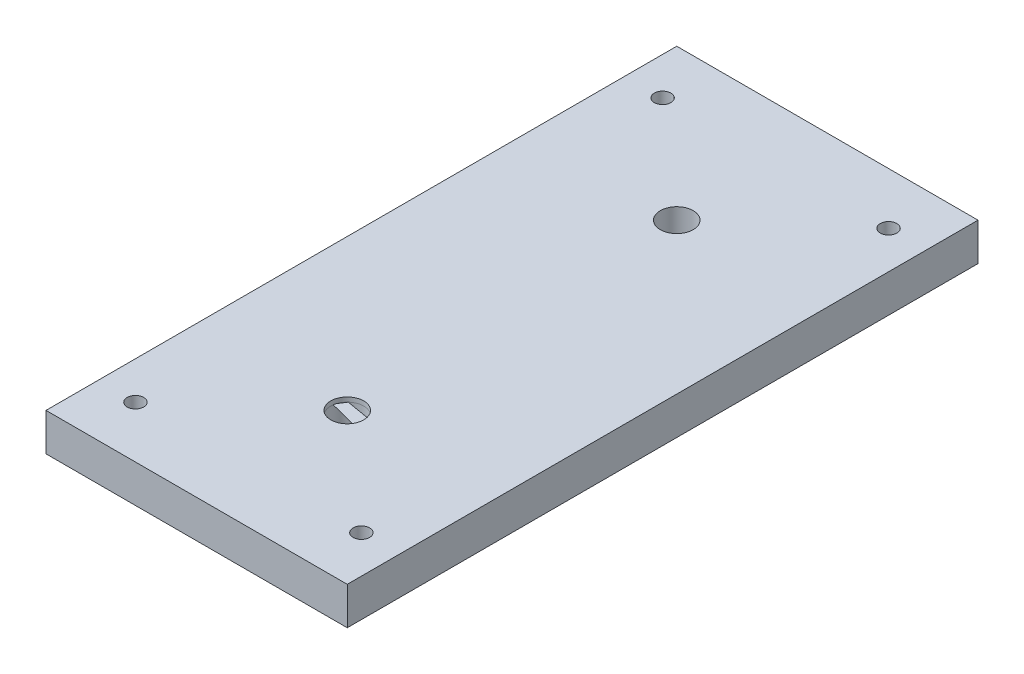
ISO-10303-21;
HEADER;
FILE_DESCRIPTION(('STEP AP214'),'2;1');
FILE_NAME('part.step','',(''),(''),'','','');
FILE_SCHEMA(('AUTOMOTIVE_DESIGN { 1 0 10303 214 1 1 1 1 }'));
ENDSEC;
DATA;
#1=APPLICATION_CONTEXT('core data for automotive mechanical design processes');
#2=APPLICATION_PROTOCOL_DEFINITION('international standard','automotive_design',2000,#1);
#3=PRODUCT_CONTEXT('',#1,'mechanical');
#4=PRODUCT('Part','Part','',(#3));
#5=PRODUCT_RELATED_PRODUCT_CATEGORY('part','',(#4));
#6=PRODUCT_DEFINITION_FORMATION('','',#4);
#7=PRODUCT_DEFINITION_CONTEXT('part definition',#1,'design');
#8=PRODUCT_DEFINITION('design','',#6,#7);
#9=PRODUCT_DEFINITION_SHAPE('','',#8);
#10=(LENGTH_UNIT() NAMED_UNIT(*) SI_UNIT(.MILLI.,.METRE.));
#11=(NAMED_UNIT(*) PLANE_ANGLE_UNIT() SI_UNIT($,.RADIAN.));
#12=(NAMED_UNIT(*) SI_UNIT($,.STERADIAN.) SOLID_ANGLE_UNIT());
#13=UNCERTAINTY_MEASURE_WITH_UNIT(LENGTH_MEASURE(1.E-05),#10,'distance_accuracy_value','');
#14=(GEOMETRIC_REPRESENTATION_CONTEXT(3) GLOBAL_UNCERTAINTY_ASSIGNED_CONTEXT((#13)) GLOBAL_UNIT_ASSIGNED_CONTEXT((#10,
#11,#12)) REPRESENTATION_CONTEXT('',''));
#15=CARTESIAN_POINT('',(0.,0.,0.));
#16=DIRECTION('',(0.,0.,1.));
#17=DIRECTION('',(1.,0.,0.));
#18=AXIS2_PLACEMENT_3D('',#15,#16,#17);
#19=CARTESIAN_POINT('',(-3.1511529728443,-11.365306556526,-3.57587472478323));
#20=DIRECTION('',(0.,-1.,0.));
#21=DIRECTION('',(0.,0.,1.));
#22=AXIS2_PLACEMENT_3D('',#19,#20,#21);
#23=SPHERICAL_SURFACE('',#22,12.7);
#24=CARTESIAN_POINT('',(-3.1511529728443,-0.252806556526004,-3.57587472478323));
#25=DIRECTION('',(0.,-1.,0.));
#26=DIRECTION('',(0.,0.,-1.));
#27=AXIS2_PLACEMENT_3D('',#24,#25,#26);
#28=CIRCLE('',#27,6.14836106210427);
#29=CARTESIAN_POINT('',(-3.1511529728443,-0.252806556526004,-9.7242357868875));
#30=VERTEX_POINT('',#29);
#31=EDGE_CURVE('E11',#30,#30,#28,.T.);
#32=ORIENTED_EDGE('',*,*,#31,.F.);
#33=EDGE_LOOP('',(#32));
#34=FACE_BOUND('',#33,.T.);
#35=ADVANCED_FACE('F43',(#34),#23,.T.);
#36=CARTESIAN_POINT('',(-12.2889229741077,-0.252806556526004,-28.2015692205846));
#37=DIRECTION('',(0.,-1.,0.));
#38=DIRECTION('',(0.,0.,-1.));
#39=AXIS2_PLACEMENT_3D('',#36,#37,#38);
#40=PLANE('',#39);
#41=ORIENTED_EDGE('',*,*,#31,.T.);
#42=EDGE_LOOP('',(#41));
#43=FACE_BOUND('',#42,.T.);
#44=ADVANCED_FACE('F50',(#43),#40,.T.);
#45=CLOSED_SHELL('',(#35,#44));
#46=MANIFOLD_SOLID_BREP('B2',#45);
#47=CARTESIAN_POINT('',(0.,-0.252806556526004,0.));
#48=DIRECTION('',(0.,1.,0.));
#49=DIRECTION('',(0.,0.,1.));
#50=AXIS2_PLACEMENT_3D('',#47,#48,#49);
#51=PLANE('',#50);
#52=CARTESIAN_POINT('',(15.8988470271548,-0.252806556526004,40.8741252752168));
#53=DIRECTION('',(0.,-1.,0.));
#54=DIRECTION('',(0.,0.,-1.));
#55=AXIS2_PLACEMENT_3D('',#52,#53,#54);
#56=CIRCLE('',#55,1.397);
#57=CARTESIAN_POINT('',(15.8988470271548,-0.252806556526004,39.4771252752168));
#58=VERTEX_POINT('',#57);
#59=EDGE_CURVE('E241',#58,#58,#56,.T.);
#60=ORIENTED_EDGE('',*,*,#59,.F.);
#61=EDGE_LOOP('',(#60));
#62=FACE_BOUND('',#61,.T.);
#63=CARTESIAN_POINT('',(-22.2011529728452,-0.252806556526004,40.8741252752165));
#64=DIRECTION('',(0.,-1.,0.));
#65=DIRECTION('',(0.,0.,-1.));
#66=AXIS2_PLACEMENT_3D('',#63,#64,#65);
#67=CIRCLE('',#66,1.397);
#68=CARTESIAN_POINT('',(-22.2011529728452,-0.252806556526004,39.4771252752165));
#69=VERTEX_POINT('',#68);
#70=EDGE_CURVE('E237',#69,#69,#67,.T.);
#71=ORIENTED_EDGE('',*,*,#70,.F.);
#72=EDGE_LOOP('',(#71));
#73=FACE_BOUND('',#72,.T.);
#74=CARTESIAN_POINT('',(15.8988470271557,-0.252806556526004,-48.0258747247832));
#75=DIRECTION('',(0.,-1.,0.));
#76=DIRECTION('',(0.,0.,-1.));
#77=AXIS2_PLACEMENT_3D('',#74,#75,#76);
#78=CIRCLE('',#77,1.397);
#79=CARTESIAN_POINT('',(15.8988470271557,-0.252806556526004,-49.4228747247832));
#80=VERTEX_POINT('',#79);
#81=EDGE_CURVE('E233',#80,#80,#78,.T.);
#82=ORIENTED_EDGE('',*,*,#81,.F.);
#83=EDGE_LOOP('',(#82));
#84=FACE_BOUND('',#83,.T.);
#85=CARTESIAN_POINT('',(-22.2011529728443,-0.252806556526004,-48.0258747247835));
#86=DIRECTION('',(0.,-1.,0.));
#87=DIRECTION('',(0.,0.,-1.));
#88=AXIS2_PLACEMENT_3D('',#85,#86,#87);
#89=CIRCLE('',#88,1.397);
#90=CARTESIAN_POINT('',(-22.2011529728443,-0.252806556526004,-49.4228747247835));
#91=VERTEX_POINT('',#90);
#92=EDGE_CURVE('E228',#91,#91,#89,.T.);
#93=ORIENTED_EDGE('',*,*,#92,.F.);
#94=EDGE_LOOP('',(#93));
#95=FACE_BOUND('',#94,.T.);
#96=DIRECTION('',(1.,0.,0.));
#97=VECTOR('',#96,1.);
#98=CARTESIAN_POINT('',(-28.5511529728443,-0.252806556526004,49.6053752752168));
#99=LINE('',#98,#97);
#100=CARTESIAN_POINT('',(-28.5511529728443,-0.252806556526004,49.6053752752168));
#101=VERTEX_POINT('',#100);
#102=CARTESIAN_POINT('',(22.2488470271557,-0.252806556526004,49.6053752752168));
#103=VERTEX_POINT('',#102);
#104=EDGE_CURVE('E124',#101,#103,#99,.T.);
#105=ORIENTED_EDGE('',*,*,#104,.F.);
#106=DIRECTION('',(0.,0.,1.));
#107=VECTOR('',#106,1.);
#108=CARTESIAN_POINT('',(-28.5511529728443,-0.252806556526004,-56.7571247247832));
#109=LINE('',#108,#107);
#110=CARTESIAN_POINT('',(-28.5511529728443,-0.252806556526004,-56.7571247247832));
#111=VERTEX_POINT('',#110);
#112=EDGE_CURVE('E113',#111,#101,#109,.T.);
#113=ORIENTED_EDGE('',*,*,#112,.F.);
#114=DIRECTION('',(-1.,0.,0.));
#115=VECTOR('',#114,1.);
#116=CARTESIAN_POINT('',(-28.5511529728443,-0.252806556526004,-56.7571247247832));
#117=LINE('',#116,#115);
#118=CARTESIAN_POINT('',(22.2488470271557,-0.252806556526004,-56.7571247247832));
#119=VERTEX_POINT('',#118);
#120=EDGE_CURVE('E133',#119,#111,#117,.T.);
#121=ORIENTED_EDGE('',*,*,#120,.F.);
#122=DIRECTION('',(0.,0.,-1.));
#123=VECTOR('',#122,1.);
#124=CARTESIAN_POINT('',(22.2488470271557,-0.252806556526004,-56.7571247247832));
#125=LINE('',#124,#123);
#126=EDGE_CURVE('E137',#103,#119,#125,.T.);
#127=ORIENTED_EDGE('',*,*,#126,.F.);
#128=EDGE_LOOP('',(#105,#113,#121,#127));
#129=FACE_BOUND('',#128,.T.);
#130=CARTESIAN_POINT('',(-3.15115297284421,-0.252806556526004,-31.3571247247832));
#131=DIRECTION('',(0.,1.,0.));
#132=DIRECTION('',(0.,0.,1.));
#133=AXIS2_PLACEMENT_3D('',#130,#131,#132);
#134=CIRCLE('',#133,2.7781250000001);
#135=CARTESIAN_POINT('',(-3.15115297284431,-0.252806556526005,-34.1352497247832));
#136=VERTEX_POINT('',#135);
#137=EDGE_CURVE('E225',#136,#136,#134,.T.);
#138=ORIENTED_EDGE('',*,*,#137,.T.);
#139=EDGE_LOOP('',(#138));
#140=FACE_BOUND('',#139,.T.);
#141=CARTESIAN_POINT('',(-3.17534581292681,-0.252806556526004,24.2114587291356));
#142=DIRECTION('',(0.,1.,0.));
#143=DIRECTION('',(0.,0.,1.));
#144=AXIS2_PLACEMENT_3D('',#141,#142,#143);
#145=CIRCLE('',#144,2.80307098009381);
#146=CARTESIAN_POINT('',(-3.17534581292681,-0.252806556526004,27.0145297092294));
#147=VERTEX_POINT('',#146);
#148=EDGE_CURVE('E145',#147,#147,#145,.T.);
#149=ORIENTED_EDGE('',*,*,#148,.T.);
#150=EDGE_LOOP('',(#149));
#151=FACE_BOUND('',#150,.T.);
#152=ADVANCED_FACE('F70',(#62,#73,#84,#95,#129,#140,#151),#51,.F.);
#153=CARTESIAN_POINT('',(-3.17534581292681,-0.252806556526004,24.2114587291356));
#154=DIRECTION('',(0.,1.,0.));
#155=DIRECTION('',(0.,0.,1.));
#156=AXIS2_PLACEMENT_3D('',#153,#154,#155);
#157=CYLINDRICAL_SURFACE('',#156,2.80307098009381);
#158=ORIENTED_EDGE('',*,*,#148,.F.);
#159=EDGE_LOOP('',(#158));
#160=FACE_BOUND('',#159,.T.);
#161=CARTESIAN_POINT('',(-3.17534581292681,5.335193443474,24.2114587291356));
#162=DIRECTION('',(0.,1.,0.));
#163=DIRECTION('',(0.,0.,1.));
#164=AXIS2_PLACEMENT_3D('',#161,#162,#163);
#165=CIRCLE('',#164,2.80307098009381);
#166=CARTESIAN_POINT('',(-0.456901891047282,5.335193443474,23.5278875455415));
#167=VERTEX_POINT('',#166);
#168=EDGE_CURVE('E152',#167,#167,#165,.T.);
#169=ORIENTED_EDGE('',*,*,#168,.T.);
#170=EDGE_LOOP('',(#169));
#171=FACE_BOUND('',#170,.T.);
#172=ADVANCED_FACE('F163',(#160,#171),#157,.F.);
#173=CARTESIAN_POINT('',(-28.5511529728443,-0.252806556526004,-56.7571247247832));
#174=DIRECTION('',(-1.,0.,0.));
#175=DIRECTION('',(0.,0.,1.));
#176=AXIS2_PLACEMENT_3D('',#173,#174,#175);
#177=PLANE('',#176);
#178=DIRECTION('',(0.,0.,1.));
#179=VECTOR('',#178,1.);
#180=CARTESIAN_POINT('',(-28.5511529728443,6.097193443474,-56.7571247247832));
#181=LINE('',#180,#179);
#182=CARTESIAN_POINT('',(-28.5511529728443,6.097193443474,-56.7571247247832));
#183=VERTEX_POINT('',#182);
#184=CARTESIAN_POINT('',(-28.5511529728443,6.097193443474,49.6053752752168));
#185=VERTEX_POINT('',#184);
#186=EDGE_CURVE('E143',#183,#185,#181,.T.);
#187=ORIENTED_EDGE('',*,*,#186,.F.);
#188=DIRECTION('',(0.,1.,0.));
#189=VECTOR('',#188,1.);
#190=CARTESIAN_POINT('',(-28.5511529728443,-0.252806556526004,-56.7571247247832));
#191=LINE('',#190,#189);
#192=EDGE_CURVE('E119',#111,#183,#191,.T.);
#193=ORIENTED_EDGE('',*,*,#192,.F.);
#194=ORIENTED_EDGE('',*,*,#112,.T.);
#195=DIRECTION('',(0.,1.,0.));
#196=VECTOR('',#195,1.);
#197=CARTESIAN_POINT('',(-28.5511529728443,-0.252806556526004,49.6053752752168));
#198=LINE('',#197,#196);
#199=EDGE_CURVE('E116',#101,#185,#198,.T.);
#200=ORIENTED_EDGE('',*,*,#199,.T.);
#201=EDGE_LOOP('',(#187,#193,#194,#200));
#202=FACE_BOUND('',#201,.T.);
#203=ADVANCED_FACE('F115',(#202),#177,.T.);
#204=CARTESIAN_POINT('',(-28.5511529728443,-0.252806556526004,-56.7571247247832));
#205=DIRECTION('',(0.,0.,-1.));
#206=DIRECTION('',(-1.,0.,0.));
#207=AXIS2_PLACEMENT_3D('',#204,#205,#206);
#208=PLANE('',#207);
#209=DIRECTION('',(-1.,0.,0.));
#210=VECTOR('',#209,1.);
#211=CARTESIAN_POINT('',(-28.5511529728443,6.097193443474,-56.7571247247832));
#212=LINE('',#211,#210);
#213=CARTESIAN_POINT('',(22.2488470271557,6.097193443474,-56.7571247247832));
#214=VERTEX_POINT('',#213);
#215=EDGE_CURVE('E125',#214,#183,#212,.T.);
#216=ORIENTED_EDGE('',*,*,#215,.F.);
#217=DIRECTION('',(0.,1.,0.));
#218=VECTOR('',#217,1.);
#219=CARTESIAN_POINT('',(22.2488470271557,-0.252806556526004,-56.7571247247832));
#220=LINE('',#219,#218);
#221=EDGE_CURVE('E153',#119,#214,#220,.T.);
#222=ORIENTED_EDGE('',*,*,#221,.F.);
#223=ORIENTED_EDGE('',*,*,#120,.T.);
#224=ORIENTED_EDGE('',*,*,#192,.T.);
#225=EDGE_LOOP('',(#216,#222,#223,#224));
#226=FACE_BOUND('',#225,.T.);
#227=ADVANCED_FACE('F171',(#226),#208,.T.);
#228=CARTESIAN_POINT('',(22.2488470271557,-0.252806556526004,-56.7571247247832));
#229=DIRECTION('',(1.,0.,0.));
#230=DIRECTION('',(0.,0.,-1.));
#231=AXIS2_PLACEMENT_3D('',#228,#229,#230);
#232=PLANE('',#231);
#233=DIRECTION('',(0.,0.,-1.));
#234=VECTOR('',#233,1.);
#235=CARTESIAN_POINT('',(22.2488470271557,6.097193443474,-56.7571247247832));
#236=LINE('',#235,#234);
#237=CARTESIAN_POINT('',(22.2488470271557,6.097193443474,49.6053752752168));
#238=VERTEX_POINT('',#237);
#239=EDGE_CURVE('E147',#238,#214,#236,.T.);
#240=ORIENTED_EDGE('',*,*,#239,.F.);
#241=DIRECTION('',(0.,1.,0.));
#242=VECTOR('',#241,1.);
#243=CARTESIAN_POINT('',(22.2488470271557,-0.252806556526004,49.6053752752168));
#244=LINE('',#243,#242);
#245=EDGE_CURVE('E132',#103,#238,#244,.T.);
#246=ORIENTED_EDGE('',*,*,#245,.F.);
#247=ORIENTED_EDGE('',*,*,#126,.T.);
#248=ORIENTED_EDGE('',*,*,#221,.T.);
#249=EDGE_LOOP('',(#240,#246,#247,#248));
#250=FACE_BOUND('',#249,.T.);
#251=ADVANCED_FACE('F182',(#250),#232,.T.);
#252=CARTESIAN_POINT('',(-28.5511529728443,-0.252806556526004,49.6053752752168));
#253=DIRECTION('',(0.,0.,1.));
#254=DIRECTION('',(1.,0.,0.));
#255=AXIS2_PLACEMENT_3D('',#252,#253,#254);
#256=PLANE('',#255);
#257=DIRECTION('',(1.,0.,0.));
#258=VECTOR('',#257,1.);
#259=CARTESIAN_POINT('',(-28.5511529728443,6.097193443474,49.6053752752168));
#260=LINE('',#259,#258);
#261=EDGE_CURVE('E131',#185,#238,#260,.T.);
#262=ORIENTED_EDGE('',*,*,#261,.F.);
#263=ORIENTED_EDGE('',*,*,#199,.F.);
#264=ORIENTED_EDGE('',*,*,#104,.T.);
#265=ORIENTED_EDGE('',*,*,#245,.T.);
#266=EDGE_LOOP('',(#262,#263,#264,#265));
#267=FACE_BOUND('',#266,.T.);
#268=ADVANCED_FACE('F129',(#267),#256,.T.);
#269=CARTESIAN_POINT('',(-3.1511529728443,6.097193443474,-3.57587472478323));
#270=DIRECTION('',(0.,1.,0.));
#271=DIRECTION('',(0.,0.,1.));
#272=AXIS2_PLACEMENT_3D('',#269,#270,#271);
#273=PLANE('',#272);
#274=CARTESIAN_POINT('',(15.8988470271548,6.097193443474,40.8741252752168));
#275=DIRECTION('',(0.,-1.,0.));
#276=DIRECTION('',(0.,0.,-1.));
#277=AXIS2_PLACEMENT_3D('',#274,#275,#276);
#278=CIRCLE('',#277,1.397);
#279=CARTESIAN_POINT('',(15.8988470271548,6.097193443474,39.4771252752168));
#280=VERTEX_POINT('',#279);
#281=EDGE_CURVE('E204',#280,#280,#278,.T.);
#282=ORIENTED_EDGE('',*,*,#281,.T.);
#283=EDGE_LOOP('',(#282));
#284=FACE_BOUND('',#283,.T.);
#285=CARTESIAN_POINT('',(-22.2011529728452,6.097193443474,40.8741252752165));
#286=DIRECTION('',(0.,-1.,0.));
#287=DIRECTION('',(0.,0.,-1.));
#288=AXIS2_PLACEMENT_3D('',#285,#286,#287);
#289=CIRCLE('',#288,1.397);
#290=CARTESIAN_POINT('',(-22.2011529728452,6.097193443474,39.4771252752165));
#291=VERTEX_POINT('',#290);
#292=EDGE_CURVE('E208',#291,#291,#289,.T.);
#293=ORIENTED_EDGE('',*,*,#292,.T.);
#294=EDGE_LOOP('',(#293));
#295=FACE_BOUND('',#294,.T.);
#296=CARTESIAN_POINT('',(15.8988470271557,6.097193443474,-48.0258747247832));
#297=DIRECTION('',(0.,-1.,0.));
#298=DIRECTION('',(0.,0.,-1.));
#299=AXIS2_PLACEMENT_3D('',#296,#297,#298);
#300=CIRCLE('',#299,1.397);
#301=CARTESIAN_POINT('',(15.8988470271557,6.097193443474,-49.4228747247832));
#302=VERTEX_POINT('',#301);
#303=EDGE_CURVE('E212',#302,#302,#300,.T.);
#304=ORIENTED_EDGE('',*,*,#303,.T.);
#305=EDGE_LOOP('',(#304));
#306=FACE_BOUND('',#305,.T.);
#307=CARTESIAN_POINT('',(-22.2011529728443,6.097193443474,-48.0258747247835));
#308=DIRECTION('',(0.,-1.,0.));
#309=DIRECTION('',(0.,0.,-1.));
#310=AXIS2_PLACEMENT_3D('',#307,#308,#309);
#311=CIRCLE('',#310,1.397);
#312=CARTESIAN_POINT('',(-22.2011529728443,6.097193443474,-49.4228747247835));
#313=VERTEX_POINT('',#312);
#314=EDGE_CURVE('E216',#313,#313,#311,.T.);
#315=ORIENTED_EDGE('',*,*,#314,.T.);
#316=EDGE_LOOP('',(#315));
#317=FACE_BOUND('',#316,.T.);
#318=ORIENTED_EDGE('',*,*,#239,.T.);
#319=ORIENTED_EDGE('',*,*,#215,.T.);
#320=ORIENTED_EDGE('',*,*,#186,.T.);
#321=ORIENTED_EDGE('',*,*,#261,.T.);
#322=EDGE_LOOP('',(#318,#319,#320,#321));
#323=FACE_BOUND('',#322,.T.);
#324=CARTESIAN_POINT('',(-3.1511529728443,6.097193443474,24.2053752752168));
#325=DIRECTION('',(0.,1.,0.));
#326=DIRECTION('',(0.,0.,1.));
#327=AXIS2_PLACEMENT_3D('',#324,#325,#326);
#328=CIRCLE('',#327,2.778125);
#329=CARTESIAN_POINT('',(-3.1511529728443,6.097193443474,26.9835002752168));
#330=VERTEX_POINT('',#329);
#331=EDGE_CURVE('E78',#330,#330,#328,.T.);
#332=ORIENTED_EDGE('',*,*,#331,.F.);
#333=EDGE_LOOP('',(#332));
#334=FACE_BOUND('',#333,.T.);
#335=CARTESIAN_POINT('',(-3.15115297284431,6.097193443474,-31.3571247247832));
#336=DIRECTION('',(0.,1.,0.));
#337=DIRECTION('',(0.,0.,1.));
#338=AXIS2_PLACEMENT_3D('',#335,#336,#337);
#339=CIRCLE('',#338,2.778125);
#340=CARTESIAN_POINT('',(-3.15115297284431,6.09719344347399,-34.1352497247832));
#341=VERTEX_POINT('',#340);
#342=EDGE_CURVE('E41',#341,#341,#339,.T.);
#343=ORIENTED_EDGE('',*,*,#342,.F.);
#344=EDGE_LOOP('',(#343));
#345=FACE_BOUND('',#344,.T.);
#346=CARTESIAN_POINT('',(-3.1511529728443,6.09719344347399,-3.57587472478323));
#347=VERTEX_POINT('',#346);
#348=VERTEX_LOOP('',#347);
#349=FACE_BOUND('',#348,.T.);
#350=ADVANCED_FACE('F188',(#284,#295,#306,#317,#323,#334,#345,#349),#273,.T.);
#351=CARTESIAN_POINT('',(-3.15115297284431,6.097193443474,-31.3571247247832));
#352=DIRECTION('',(0.,-1.,0.));
#353=DIRECTION('',(0.,0.,-1.));
#354=AXIS2_PLACEMENT_3D('',#351,#352,#353);
#355=CYLINDRICAL_SURFACE('',#354,2.778125);
#356=CARTESIAN_POINT('',(-3.15115297284431,6.09719344347399,-34.1352497247832));
#357=CARTESIAN_POINT('',(-3.15115297284431,6.03104761014066,-34.1352497247832));
#358=CARTESIAN_POINT('',(-3.15115297284431,5.96490177680733,-34.1352497247832));
#359=CARTESIAN_POINT('',(-3.15115297284431,5.83261011014066,-34.1352497247832));
#360=CARTESIAN_POINT('',(-3.15115297284431,5.76646427680733,-34.1352497247832));
#361=CARTESIAN_POINT('',(-3.15115297284431,5.63417261014066,-34.1352497247832));
#362=CARTESIAN_POINT('',(-3.15115297284431,5.56802677680733,-34.1352497247832));
#363=CARTESIAN_POINT('',(-3.15115297284431,5.43573511014066,-34.1352497247832));
#364=CARTESIAN_POINT('',(-3.15115297284431,5.36958927680733,-34.1352497247832));
#365=CARTESIAN_POINT('',(-3.15115297284431,5.23729761014066,-34.1352497247832));
#366=CARTESIAN_POINT('',(-3.15115297284431,5.17115177680733,-34.1352497247832));
#367=CARTESIAN_POINT('',(-3.15115297284431,5.03886011014066,-34.1352497247832));
#368=CARTESIAN_POINT('',(-3.15115297284431,4.97271427680733,-34.1352497247832));
#369=CARTESIAN_POINT('',(-3.15115297284431,4.84042261014066,-34.1352497247832));
#370=CARTESIAN_POINT('',(-3.15115297284431,4.77427677680733,-34.1352497247832));
#371=CARTESIAN_POINT('',(-3.15115297284431,4.64198511014066,-34.1352497247832));
#372=CARTESIAN_POINT('',(-3.15115297284431,4.57583927680733,-34.1352497247832));
#373=CARTESIAN_POINT('',(-3.15115297284431,4.44354761014066,-34.1352497247832));
#374=CARTESIAN_POINT('',(-3.15115297284431,4.37740177680733,-34.1352497247832));
#375=CARTESIAN_POINT('',(-3.15115297284431,4.24511011014066,-34.1352497247832));
#376=CARTESIAN_POINT('',(-3.15115297284431,4.17896427680733,-34.1352497247832));
#377=CARTESIAN_POINT('',(-3.15115297284431,4.04667261014066,-34.1352497247832));
#378=CARTESIAN_POINT('',(-3.15115297284431,3.98052677680733,-34.1352497247832));
#379=CARTESIAN_POINT('',(-3.15115297284431,3.84823511014066,-34.1352497247832));
#380=CARTESIAN_POINT('',(-3.15115297284431,3.78208927680733,-34.1352497247832));
#381=CARTESIAN_POINT('',(-3.15115297284431,3.64979761014066,-34.1352497247832));
#382=CARTESIAN_POINT('',(-3.15115297284431,3.58365177680733,-34.1352497247832));
#383=CARTESIAN_POINT('',(-3.15115297284431,3.45136011014066,-34.1352497247832));
#384=CARTESIAN_POINT('',(-3.15115297284431,3.38521427680733,-34.1352497247832));
#385=CARTESIAN_POINT('',(-3.15115297284431,3.25292261014066,-34.1352497247832));
#386=CARTESIAN_POINT('',(-3.15115297284431,3.18677677680733,-34.1352497247832));
#387=CARTESIAN_POINT('',(-3.15115297284431,3.05448511014066,-34.1352497247832));
#388=CARTESIAN_POINT('',(-3.15115297284431,2.98833927680733,-34.1352497247832));
#389=CARTESIAN_POINT('',(-3.15115297284431,2.85604761014066,-34.1352497247832));
#390=CARTESIAN_POINT('',(-3.15115297284431,2.78990177680733,-34.1352497247832));
#391=CARTESIAN_POINT('',(-3.15115297284431,2.65761011014066,-34.1352497247832));
#392=CARTESIAN_POINT('',(-3.15115297284431,2.59146427680733,-34.1352497247832));
#393=CARTESIAN_POINT('',(-3.15115297284431,2.45917261014066,-34.1352497247832));
#394=CARTESIAN_POINT('',(-3.15115297284431,2.39302677680733,-34.1352497247832));
#395=CARTESIAN_POINT('',(-3.15115297284431,2.26073511014066,-34.1352497247832));
#396=CARTESIAN_POINT('',(-3.15115297284431,2.19458927680733,-34.1352497247832));
#397=CARTESIAN_POINT('',(-3.15115297284431,2.06229761014066,-34.1352497247832));
#398=CARTESIAN_POINT('',(-3.15115297284431,1.99615177680733,-34.1352497247832));
#399=CARTESIAN_POINT('',(-3.15115297284431,1.86386011014066,-34.1352497247832));
#400=CARTESIAN_POINT('',(-3.15115297284431,1.79771427680733,-34.1352497247832));
#401=CARTESIAN_POINT('',(-3.15115297284431,1.66542261014066,-34.1352497247832));
#402=CARTESIAN_POINT('',(-3.15115297284431,1.59927677680733,-34.1352497247832));
#403=CARTESIAN_POINT('',(-3.15115297284431,1.46698511014066,-34.1352497247832));
#404=CARTESIAN_POINT('',(-3.15115297284431,1.40083927680733,-34.1352497247832));
#405=CARTESIAN_POINT('',(-3.15115297284431,1.26854761014066,-34.1352497247832));
#406=CARTESIAN_POINT('',(-3.15115297284431,1.20240177680733,-34.1352497247832));
#407=CARTESIAN_POINT('',(-3.15115297284431,1.07011011014066,-34.1352497247832));
#408=CARTESIAN_POINT('',(-3.15115297284431,1.00396427680733,-34.1352497247832));
#409=CARTESIAN_POINT('',(-3.15115297284431,0.871672610140661,-34.1352497247832));
#410=CARTESIAN_POINT('',(-3.15115297284431,0.805526776807328,-34.1352497247832));
#411=CARTESIAN_POINT('',(-3.15115297284431,0.673235110140661,-34.1352497247832));
#412=CARTESIAN_POINT('',(-3.15115297284431,0.607089276807328,-34.1352497247832));
#413=CARTESIAN_POINT('',(-3.15115297284431,0.474797610140662,-34.1352497247832));
#414=CARTESIAN_POINT('',(-3.15115297284431,0.408651776807328,-34.1352497247832));
#415=CARTESIAN_POINT('',(-3.15115297284431,0.276360110140661,-34.1352497247832));
#416=CARTESIAN_POINT('',(-3.15115297284431,0.210214276807328,-34.1352497247832));
#417=CARTESIAN_POINT('',(-3.15115297284431,0.077922610140661,-34.1352497247832));
#418=CARTESIAN_POINT('',(-3.15115297284431,0.0117767768073277,-34.1352497247832));
#419=CARTESIAN_POINT('',(-3.15115297284431,-0.120514889859339,-34.1352497247832));
#420=CARTESIAN_POINT('',(-3.15115297284431,-0.186660723192672,-34.1352497247832));
#421=CARTESIAN_POINT('',(-3.15115297284431,-0.252806556526005,-34.1352497247832));
#422=B_SPLINE_CURVE_WITH_KNOTS('',3,(#356,#357,#358,#359,#360,#361,#362,#363,#364,#365,#366,
#367,#368,#369,#370,#371,#372,#373,#374,#375,#376,#377,#378,#379,#380,#381,#382,#383,#384,#385,
#386,#387,#388,#389,#390,#391,#392,#393,#394,#395,#396,#397,#398,#399,#400,#401,#402,#403,#404,
#405,#406,#407,#408,#409,#410,#411,#412,#413,#414,#415,#416,#417,#418,#419,#420,#421),
.UNSPECIFIED.,.F.,.F.,(4,2,2,2,2,2,2,2,2,2,2,2,2,2,2,2,2,2,2,2,2,2,2,2,2,2,2,2,2,2,2,2,4),(0.,
0.1984375,0.396875,0.595312499999999,0.793749999999999,0.992187499999999,1.190625,1.3890625,
1.5875,1.7859375,1.984375,2.1828125,2.38125,2.5796875,2.778125,2.9765625,3.175,3.3734375,
3.571875,3.7703125,3.96875,4.1671875,4.365625,4.5640625,4.7625,4.9609375,5.159375,5.3578125,
5.55625,5.7546875,5.953125,6.1515625,6.35),.UNSPECIFIED.);
#423=EDGE_CURVE('BSEAM193',#341,#136,#422,.T.);
#424=ORIENTED_EDGE('',*,*,#342,.T.);
#425=ORIENTED_EDGE('',*,*,#137,.F.);
#426=ORIENTED_EDGE('',*,*,#423,.T.);
#427=ORIENTED_EDGE('',*,*,#423,.F.);
#428=EDGE_LOOP('',(#424,#426,#425,#427));
#429=FACE_BOUND('',#428,.T.);
#430=ADVANCED_FACE('F193',(#429),#355,.F.);
#431=CARTESIAN_POINT('',(-3.1511529728443,6.097193443474,24.2053752752168));
#432=DIRECTION('',(0.,-1.,0.));
#433=DIRECTION('',(0.,0.,-1.));
#434=AXIS2_PLACEMENT_3D('',#431,#432,#433);
#435=CYLINDRICAL_SURFACE('',#434,2.778125);
#436=ORIENTED_EDGE('',*,*,#331,.T.);
#437=EDGE_LOOP('',(#436));
#438=FACE_BOUND('',#437,.T.);
#439=CARTESIAN_POINT('',(-3.1511529728443,5.335193443474,24.2053752752168));
#440=DIRECTION('',(0.,1.,0.));
#441=DIRECTION('',(0.,0.,1.));
#442=AXIS2_PLACEMENT_3D('',#439,#440,#441);
#443=CIRCLE('',#442,2.778125);
#444=EDGE_CURVE('E86',#167,#167,#443,.T.);
#445=ORIENTED_EDGE('',*,*,#444,.F.);
#446=EDGE_LOOP('',(#445));
#447=FACE_BOUND('',#446,.T.);
#448=ADVANCED_FACE('F190',(#438,#447),#435,.F.);
#449=CARTESIAN_POINT('',(-3.1511529728443,5.335193443474,-3.57587472478323));
#450=DIRECTION('',(0.,1.,0.));
#451=DIRECTION('',(0.,0.,1.));
#452=AXIS2_PLACEMENT_3D('',#449,#450,#451);
#453=PLANE('',#452);
#454=ORIENTED_EDGE('',*,*,#444,.T.);
#455=ORIENTED_EDGE('',*,*,#168,.F.);
#456=EDGE_LOOP('',(#454,#455));
#457=FACE_BOUND('',#456,.T.);
#458=ADVANCED_FACE('F72',(#457),#453,.F.);
#459=CARTESIAN_POINT('',(-22.2011529728443,6.097193443474,-48.0258747247835));
#460=DIRECTION('',(0.,-1.,0.));
#461=DIRECTION('',(0.,0.,-1.));
#462=AXIS2_PLACEMENT_3D('',#459,#460,#461);
#463=CYLINDRICAL_SURFACE('',#462,1.397);
#464=ORIENTED_EDGE('',*,*,#314,.F.);
#465=EDGE_LOOP('',(#464));
#466=FACE_BOUND('',#465,.T.);
#467=ORIENTED_EDGE('',*,*,#92,.T.);
#468=EDGE_LOOP('',(#467));
#469=FACE_BOUND('',#468,.T.);
#470=ADVANCED_FACE('F177',(#466,#469),#463,.F.);
#471=CARTESIAN_POINT('',(15.8988470271557,6.097193443474,-48.0258747247832));
#472=DIRECTION('',(0.,-1.,0.));
#473=DIRECTION('',(0.,0.,-1.));
#474=AXIS2_PLACEMENT_3D('',#471,#472,#473);
#475=CYLINDRICAL_SURFACE('',#474,1.397);
#476=ORIENTED_EDGE('',*,*,#303,.F.);
#477=EDGE_LOOP('',(#476));
#478=FACE_BOUND('',#477,.T.);
#479=ORIENTED_EDGE('',*,*,#81,.T.);
#480=EDGE_LOOP('',(#479));
#481=FACE_BOUND('',#480,.T.);
#482=ADVANCED_FACE('F255',(#478,#481),#475,.F.);
#483=CARTESIAN_POINT('',(-22.2011529728452,6.097193443474,40.8741252752165));
#484=DIRECTION('',(0.,-1.,0.));
#485=DIRECTION('',(0.,0.,-1.));
#486=AXIS2_PLACEMENT_3D('',#483,#484,#485);
#487=CYLINDRICAL_SURFACE('',#486,1.397);
#488=ORIENTED_EDGE('',*,*,#292,.F.);
#489=EDGE_LOOP('',(#488));
#490=FACE_BOUND('',#489,.T.);
#491=ORIENTED_EDGE('',*,*,#70,.T.);
#492=EDGE_LOOP('',(#491));
#493=FACE_BOUND('',#492,.T.);
#494=ADVANCED_FACE('F261',(#490,#493),#487,.F.);
#495=CARTESIAN_POINT('',(15.8988470271548,6.097193443474,40.8741252752168));
#496=DIRECTION('',(0.,-1.,0.));
#497=DIRECTION('',(0.,0.,-1.));
#498=AXIS2_PLACEMENT_3D('',#495,#496,#497);
#499=CYLINDRICAL_SURFACE('',#498,1.397);
#500=ORIENTED_EDGE('',*,*,#281,.F.);
#501=EDGE_LOOP('',(#500));
#502=FACE_BOUND('',#501,.T.);
#503=ORIENTED_EDGE('',*,*,#59,.T.);
#504=EDGE_LOOP('',(#503));
#505=FACE_BOUND('',#504,.T.);
#506=ADVANCED_FACE('F246',(#502,#505),#499,.F.);
#507=CLOSED_SHELL('',(#152,#172,#203,#227,#251,#268,#350,#430,#448,#458,#470,#482,#494,#506));
#508=MANIFOLD_SOLID_BREP('B6',#507);
#509=ADVANCED_BREP_SHAPE_REPRESENTATION('',(#18,#46,#508),#14);
#510=SHAPE_DEFINITION_REPRESENTATION(#9,#509);
ENDSEC;
END-ISO-10303-21;
